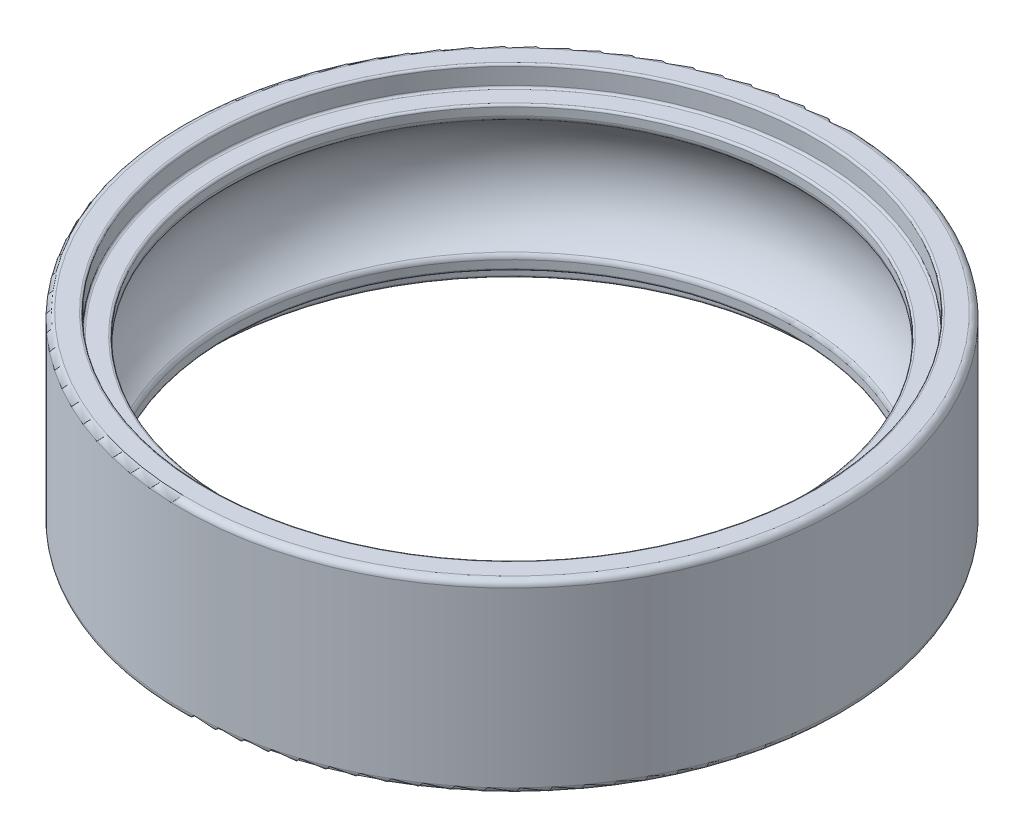
ISO-10303-21;
HEADER;
FILE_DESCRIPTION(('STEP AP214'),'2;1');
FILE_NAME('part.step','',(''),(''),'','','');
FILE_SCHEMA(('AUTOMOTIVE_DESIGN { 1 0 10303 214 1 1 1 1 }'));
ENDSEC;
DATA;
#1=APPLICATION_CONTEXT('core data for automotive mechanical design processes');
#2=APPLICATION_PROTOCOL_DEFINITION('international standard','automotive_design',2000,#1);
#3=PRODUCT_CONTEXT('',#1,'mechanical');
#4=PRODUCT('Part','Part','',(#3));
#5=PRODUCT_RELATED_PRODUCT_CATEGORY('part','',(#4));
#6=PRODUCT_DEFINITION_FORMATION('','',#4);
#7=PRODUCT_DEFINITION_CONTEXT('part definition',#1,'design');
#8=PRODUCT_DEFINITION('design','',#6,#7);
#9=PRODUCT_DEFINITION_SHAPE('','',#8);
#10=(LENGTH_UNIT() NAMED_UNIT(*) SI_UNIT(.MILLI.,.METRE.));
#11=(NAMED_UNIT(*) PLANE_ANGLE_UNIT() SI_UNIT($,.RADIAN.));
#12=(NAMED_UNIT(*) SI_UNIT($,.STERADIAN.) SOLID_ANGLE_UNIT());
#13=UNCERTAINTY_MEASURE_WITH_UNIT(LENGTH_MEASURE(1.E-05),#10,'distance_accuracy_value','');
#14=(GEOMETRIC_REPRESENTATION_CONTEXT(3) GLOBAL_UNCERTAINTY_ASSIGNED_CONTEXT((#13)) GLOBAL_UNIT_ASSIGNED_CONTEXT((#10,
#11,#12)) REPRESENTATION_CONTEXT('',''));
#15=CARTESIAN_POINT('',(0.,0.,0.));
#16=DIRECTION('',(0.,0.,1.));
#17=DIRECTION('',(1.,0.,0.));
#18=AXIS2_PLACEMENT_3D('',#15,#16,#17);
#19=CARTESIAN_POINT('',(0.,-4.1,0.));
#20=DIRECTION('',(0.,1.,0.));
#21=DIRECTION('',(-1.,0.,0.));
#22=AXIS2_PLACEMENT_3D('',#19,#20,#21);
#23=TOROIDAL_SURFACE('',#22,14.85,0.1);
#24=CARTESIAN_POINT('',(0.,-4.1,0.));
#25=DIRECTION('',(0.,-1.,0.));
#26=DIRECTION('',(1.,0.,0.));
#27=AXIS2_PLACEMENT_3D('',#24,#25,#26);
#28=CIRCLE('',#27,14.75);
#29=CARTESIAN_POINT('',(14.75,-4.1,0.));
#30=VERTEX_POINT('',#29);
#31=EDGE_CURVE('E145',#30,#30,#28,.T.);
#32=ORIENTED_EDGE('',*,*,#31,.T.);
#33=CARTESIAN_POINT('',(14.85,-4.1,0.));
#34=DIRECTION('',(0.,0.,-1.));
#35=DIRECTION('',(1.,0.,0.));
#36=AXIS2_PLACEMENT_3D('',#33,#34,#35);
#37=CIRCLE('',#36,0.1);
#38=CARTESIAN_POINT('',(14.85,-4.,0.));
#39=VERTEX_POINT('',#38);
#40=EDGE_CURVE('E11',#30,#39,#37,.T.);
#41=ORIENTED_EDGE('',*,*,#40,.T.);
#42=CARTESIAN_POINT('',(0.,-4.,0.));
#43=DIRECTION('',(0.,-1.,0.));
#44=DIRECTION('',(-1.,0.,0.));
#45=AXIS2_PLACEMENT_3D('',#42,#43,#44);
#46=CIRCLE('',#45,14.85);
#47=EDGE_CURVE('E25',#39,#39,#46,.T.);
#48=ORIENTED_EDGE('',*,*,#47,.F.);
#49=ORIENTED_EDGE('',*,*,#40,.F.);
#50=EDGE_LOOP('',(#32,#41,#48,#49));
#51=FACE_BOUND('',#50,.T.);
#52=ADVANCED_FACE('F17',(#51),#23,.T.);
#53=CARTESIAN_POINT('',(-4.307003376255,-4.,15.40940368466));
#54=DIRECTION('',(0.,1.,0.));
#55=DIRECTION('',(1.,0.,0.));
#56=AXIS2_PLACEMENT_3D('',#53,#54,#55);
#57=PLANE('',#56);
#58=ORIENTED_EDGE('',*,*,#47,.T.);
#59=EDGE_LOOP('',(#58));
#60=FACE_BOUND('',#59,.T.);
#61=CARTESIAN_POINT('',(0.,-4.,0.));
#62=DIRECTION('',(0.,1.,0.));
#63=DIRECTION('',(-0.963087730291494,0.,-0.269187711015898));
#64=AXIS2_PLACEMENT_3D('',#61,#62,#63);
#65=CIRCLE('',#64,15.7);
#66=CARTESIAN_POINT('',(-15.7,-4.,0.));
#67=VERTEX_POINT('',#66);
#68=EDGE_CURVE('E43',#67,#67,#65,.T.);
#69=ORIENTED_EDGE('',*,*,#68,.T.);
#70=EDGE_LOOP('',(#69));
#71=FACE_BOUND('',#70,.T.);
#72=ADVANCED_FACE('F288',(#60,#71),#57,.T.);
#73=CARTESIAN_POINT('',(0.,-4.3,0.));
#74=DIRECTION('',(0.,-1.,0.));
#75=DIRECTION('',(1.,0.,0.));
#76=AXIS2_PLACEMENT_3D('',#73,#74,#75);
#77=TOROIDAL_SURFACE('',#76,15.7,0.3);
#78=CARTESIAN_POINT('',(0.,-4.3,0.));
#79=DIRECTION('',(0.,1.,0.));
#80=DIRECTION('',(-1.,0.,0.));
#81=AXIS2_PLACEMENT_3D('',#78,#79,#80);
#82=CIRCLE('',#81,16.);
#83=CARTESIAN_POINT('',(-16.,-4.3,0.));
#84=VERTEX_POINT('',#83);
#85=CARTESIAN_POINT('',(16.,-4.3,0.));
#86=VERTEX_POINT('',#85);
#87=EDGE_CURVE('E267',#84,#86,#82,.T.);
#88=ORIENTED_EDGE('',*,*,#87,.T.);
#89=CARTESIAN_POINT('',(0.,-4.3,0.));
#90=DIRECTION('',(0.,1.,0.));
#91=DIRECTION('',(-1.,0.,0.));
#92=AXIS2_PLACEMENT_3D('',#89,#90,#91);
#93=CIRCLE('',#92,16.);
#94=EDGE_CURVE('E272',#86,#84,#93,.T.);
#95=ORIENTED_EDGE('',*,*,#94,.T.);
#96=CARTESIAN_POINT('',(-15.7,-4.3,0.));
#97=DIRECTION('',(0.,0.,-1.));
#98=DIRECTION('',(-1.,0.,0.));
#99=AXIS2_PLACEMENT_3D('',#96,#97,#98);
#100=CIRCLE('',#99,0.3);
#101=EDGE_CURVE('E280',#84,#67,#100,.T.);
#102=ORIENTED_EDGE('',*,*,#101,.T.);
#103=ORIENTED_EDGE('',*,*,#68,.F.);
#104=ORIENTED_EDGE('',*,*,#101,.F.);
#105=EDGE_LOOP('',(#88,#95,#102,#103,#104));
#106=FACE_BOUND('',#105,.T.);
#107=ADVANCED_FACE('F320',(#106),#77,.T.);
#108=CARTESIAN_POINT('',(0.,11.08001605136,0.));
#109=DIRECTION('',(0.,-1.,0.));
#110=DIRECTION('',(-1.,0.,0.));
#111=AXIS2_PLACEMENT_3D('',#108,#109,#110);
#112=CYLINDRICAL_SURFACE('',#111,16.);
#113=CARTESIAN_POINT('',(0.,-12.7,0.));
#114=DIRECTION('',(0.,-1.,0.));
#115=DIRECTION('',(-1.,0.,0.));
#116=AXIS2_PLACEMENT_3D('',#113,#114,#115);
#117=CIRCLE('',#116,16.);
#118=CARTESIAN_POINT('',(16.,-12.7,0.));
#119=VERTEX_POINT('',#118);
#120=EDGE_CURVE('E256',#119,#119,#117,.T.);
#121=ORIENTED_EDGE('',*,*,#120,.F.);
#122=DIRECTION('',(0.,1.,0.));
#123=VECTOR('',#122,1.);
#124=CARTESIAN_POINT('',(16.,11.08001605136,0.));
#125=LINE('',#124,#123);
#126=EDGE_CURVE('E264',#119,#86,#125,.T.);
#127=ORIENTED_EDGE('',*,*,#126,.T.);
#128=ORIENTED_EDGE('',*,*,#87,.F.);
#129=ORIENTED_EDGE('',*,*,#94,.F.);
#130=ORIENTED_EDGE('',*,*,#126,.F.);
#131=EDGE_LOOP('',(#121,#127,#128,#129,#130));
#132=FACE_BOUND('',#131,.T.);
#133=ADVANCED_FACE('F325',(#132),#112,.T.);
#134=CARTESIAN_POINT('',(0.,-12.7,0.));
#135=DIRECTION('',(0.,1.,0.));
#136=DIRECTION('',(-1.,0.,0.));
#137=AXIS2_PLACEMENT_3D('',#134,#135,#136);
#138=TOROIDAL_SURFACE('',#137,15.7,0.3);
#139=ORIENTED_EDGE('',*,*,#120,.T.);
#140=CARTESIAN_POINT('',(15.7,-12.7,0.));
#141=DIRECTION('',(0.,0.,-1.));
#142=DIRECTION('',(1.,0.,0.));
#143=AXIS2_PLACEMENT_3D('',#140,#141,#142);
#144=CIRCLE('',#143,0.3);
#145=CARTESIAN_POINT('',(15.7,-13.,0.));
#146=VERTEX_POINT('',#145);
#147=EDGE_CURVE('E265',#119,#146,#144,.T.);
#148=ORIENTED_EDGE('',*,*,#147,.T.);
#149=CARTESIAN_POINT('',(0.,-13.,0.));
#150=DIRECTION('',(0.,-1.,0.));
#151=DIRECTION('',(1.,0.,0.));
#152=AXIS2_PLACEMENT_3D('',#149,#150,#151);
#153=CIRCLE('',#152,15.7);
#154=EDGE_CURVE('E255',#146,#146,#153,.T.);
#155=ORIENTED_EDGE('',*,*,#154,.F.);
#156=ORIENTED_EDGE('',*,*,#147,.F.);
#157=EDGE_LOOP('',(#139,#148,#155,#156));
#158=FACE_BOUND('',#157,.T.);
#159=ADVANCED_FACE('F327',(#158),#138,.T.);
#160=CARTESIAN_POINT('',(-4.307003376255,-13.,15.40940368466));
#161=DIRECTION('',(0.,-1.,0.));
#162=DIRECTION('',(0.,0.,-1.));
#163=AXIS2_PLACEMENT_3D('',#160,#161,#162);
#164=PLANE('',#163);
#165=CARTESIAN_POINT('',(0.,-13.,0.));
#166=DIRECTION('',(0.,1.,0.));
#167=DIRECTION('',(1.,0.,0.));
#168=AXIS2_PLACEMENT_3D('',#165,#166,#167);
#169=CIRCLE('',#168,14.85);
#170=CARTESIAN_POINT('',(14.85,-13.,0.));
#171=VERTEX_POINT('',#170);
#172=EDGE_CURVE('E250',#171,#171,#169,.T.);
#173=ORIENTED_EDGE('',*,*,#172,.T.);
#174=EDGE_LOOP('',(#173));
#175=FACE_BOUND('',#174,.T.);
#176=ORIENTED_EDGE('',*,*,#154,.T.);
#177=EDGE_LOOP('',(#176));
#178=FACE_BOUND('',#177,.T.);
#179=ADVANCED_FACE('F331',(#175,#178),#164,.T.);
#180=CARTESIAN_POINT('',(0.,-12.9,0.));
#181=DIRECTION('',(0.,1.,0.));
#182=DIRECTION('',(-1.,0.,0.));
#183=AXIS2_PLACEMENT_3D('',#180,#181,#182);
#184=TOROIDAL_SURFACE('',#183,14.85,0.1);
#185=ORIENTED_EDGE('',*,*,#172,.F.);
#186=CARTESIAN_POINT('',(14.85,-12.9,0.));
#187=DIRECTION('',(0.,0.,-1.));
#188=DIRECTION('',(1.,0.,0.));
#189=AXIS2_PLACEMENT_3D('',#186,#187,#188);
#190=CIRCLE('',#189,0.1);
#191=CARTESIAN_POINT('',(14.75,-12.9,0.));
#192=VERTEX_POINT('',#191);
#193=EDGE_CURVE('E253',#171,#192,#190,.T.);
#194=ORIENTED_EDGE('',*,*,#193,.T.);
#195=CARTESIAN_POINT('',(0.,-12.9,0.));
#196=DIRECTION('',(0.,1.,0.));
#197=DIRECTION('',(-1.,0.,0.));
#198=AXIS2_PLACEMENT_3D('',#195,#196,#197);
#199=CIRCLE('',#198,14.75);
#200=EDGE_CURVE('E242',#192,#192,#199,.T.);
#201=ORIENTED_EDGE('',*,*,#200,.T.);
#202=ORIENTED_EDGE('',*,*,#193,.F.);
#203=EDGE_LOOP('',(#185,#194,#201,#202));
#204=FACE_BOUND('',#203,.T.);
#205=ADVANCED_FACE('F329',(#204),#184,.T.);
#206=CARTESIAN_POINT('',(0.,10.58001605136,0.));
#207=DIRECTION('',(0.,-1.,0.));
#208=DIRECTION('',(-1.,0.,0.));
#209=AXIS2_PLACEMENT_3D('',#206,#207,#208);
#210=CYLINDRICAL_SURFACE('',#209,14.75);
#211=CARTESIAN_POINT('',(0.,-12.1,0.));
#212=DIRECTION('',(0.,-1.,0.));
#213=DIRECTION('',(1.,0.,0.));
#214=AXIS2_PLACEMENT_3D('',#211,#212,#213);
#215=CIRCLE('',#214,14.75);
#216=CARTESIAN_POINT('',(14.75,-12.1,0.));
#217=VERTEX_POINT('',#216);
#218=EDGE_CURVE('E234',#217,#217,#215,.T.);
#219=ORIENTED_EDGE('',*,*,#218,.F.);
#220=DIRECTION('',(0.,-1.,0.));
#221=VECTOR('',#220,1.);
#222=CARTESIAN_POINT('',(14.75,10.58001605136,0.));
#223=LINE('',#222,#221);
#224=EDGE_CURVE('E237',#217,#192,#223,.T.);
#225=ORIENTED_EDGE('',*,*,#224,.T.);
#226=ORIENTED_EDGE('',*,*,#200,.F.);
#227=ORIENTED_EDGE('',*,*,#224,.F.);
#228=EDGE_LOOP('',(#219,#225,#226,#227));
#229=FACE_BOUND('',#228,.T.);
#230=ADVANCED_FACE('F334',(#229),#210,.F.);
#231=CARTESIAN_POINT('',(0.,-12.1,0.));
#232=DIRECTION('',(0.,1.,0.));
#233=DIRECTION('',(-1.,0.,0.));
#234=AXIS2_PLACEMENT_3D('',#231,#232,#233);
#235=TOROIDAL_SURFACE('',#234,14.65,0.1);
#236=ORIENTED_EDGE('',*,*,#218,.T.);
#237=CARTESIAN_POINT('',(14.65,-12.1,0.));
#238=DIRECTION('',(0.,0.,1.));
#239=DIRECTION('',(1.,0.,0.));
#240=AXIS2_PLACEMENT_3D('',#237,#238,#239);
#241=CIRCLE('',#240,0.1);
#242=CARTESIAN_POINT('',(14.65,-12.,0.));
#243=VERTEX_POINT('',#242);
#244=EDGE_CURVE('E240',#217,#243,#241,.T.);
#245=ORIENTED_EDGE('',*,*,#244,.T.);
#246=CARTESIAN_POINT('',(0.,-12.,0.));
#247=DIRECTION('',(0.,-1.,0.));
#248=DIRECTION('',(-1.,0.,0.));
#249=AXIS2_PLACEMENT_3D('',#246,#247,#248);
#250=CIRCLE('',#249,14.65);
#251=EDGE_CURVE('E181',#243,#243,#250,.T.);
#252=ORIENTED_EDGE('',*,*,#251,.F.);
#253=ORIENTED_EDGE('',*,*,#244,.F.);
#254=EDGE_LOOP('',(#236,#245,#252,#253));
#255=FACE_BOUND('',#254,.T.);
#256=ADVANCED_FACE('F338',(#255),#235,.F.);
#257=CARTESIAN_POINT('',(-3.943599966383,-12.,14.10923524877));
#258=DIRECTION('',(0.,-1.,0.));
#259=DIRECTION('',(0.,0.,-1.));
#260=AXIS2_PLACEMENT_3D('',#257,#258,#259);
#261=PLANE('',#260);
#262=CARTESIAN_POINT('',(0.,-12.,0.));
#263=DIRECTION('',(0.,1.,0.));
#264=DIRECTION('',(1.,0.,0.));
#265=AXIS2_PLACEMENT_3D('',#262,#263,#264);
#266=CIRCLE('',#265,13.85);
#267=CARTESIAN_POINT('',(13.85,-12.,0.));
#268=VERTEX_POINT('',#267);
#269=EDGE_CURVE('E183',#268,#268,#266,.T.);
#270=ORIENTED_EDGE('',*,*,#269,.T.);
#271=EDGE_LOOP('',(#270));
#272=FACE_BOUND('',#271,.T.);
#273=ORIENTED_EDGE('',*,*,#251,.T.);
#274=EDGE_LOOP('',(#273));
#275=FACE_BOUND('',#274,.T.);
#276=ADVANCED_FACE('F344',(#272,#275),#261,.T.);
#277=CARTESIAN_POINT('',(0.,-11.9,0.));
#278=DIRECTION('',(0.,1.,0.));
#279=DIRECTION('',(-1.,0.,0.));
#280=AXIS2_PLACEMENT_3D('',#277,#278,#279);
#281=TOROIDAL_SURFACE('',#280,13.85,0.1);
#282=ORIENTED_EDGE('',*,*,#269,.F.);
#283=CARTESIAN_POINT('',(13.85,-11.9,0.));
#284=DIRECTION('',(0.,0.,-1.));
#285=DIRECTION('',(1.,0.,0.));
#286=AXIS2_PLACEMENT_3D('',#283,#284,#285);
#287=CIRCLE('',#286,0.1);
#288=CARTESIAN_POINT('',(13.75,-11.9,0.));
#289=VERTEX_POINT('',#288);
#290=EDGE_CURVE('E180',#268,#289,#287,.T.);
#291=ORIENTED_EDGE('',*,*,#290,.T.);
#292=CARTESIAN_POINT('',(0.,-11.9,0.));
#293=DIRECTION('',(0.,1.,0.));
#294=DIRECTION('',(-1.,0.,0.));
#295=AXIS2_PLACEMENT_3D('',#292,#293,#294);
#296=CIRCLE('',#295,13.75);
#297=EDGE_CURVE('E225',#289,#289,#296,.T.);
#298=ORIENTED_EDGE('',*,*,#297,.T.);
#299=ORIENTED_EDGE('',*,*,#290,.F.);
#300=EDGE_LOOP('',(#282,#291,#298,#299));
#301=FACE_BOUND('',#300,.T.);
#302=ADVANCED_FACE('F349',(#301),#281,.T.);
#303=CARTESIAN_POINT('',(0.,10.58001605136,0.));
#304=DIRECTION('',(0.,-1.,0.));
#305=DIRECTION('',(-1.,0.,0.));
#306=AXIS2_PLACEMENT_3D('',#303,#304,#305);
#307=CYLINDRICAL_SURFACE('',#306,13.75);
#308=CARTESIAN_POINT('',(0.,-11.52489669245,0.));
#309=DIRECTION('',(0.,-1.,0.));
#310=DIRECTION('',(1.,0.,0.));
#311=AXIS2_PLACEMENT_3D('',#308,#309,#310);
#312=CIRCLE('',#311,13.75);
#313=CARTESIAN_POINT('',(13.75,-11.52489669245,0.));
#314=VERTEX_POINT('',#313);
#315=EDGE_CURVE('E213',#314,#314,#312,.T.);
#316=ORIENTED_EDGE('',*,*,#315,.F.);
#317=DIRECTION('',(0.,-1.,0.));
#318=VECTOR('',#317,1.);
#319=CARTESIAN_POINT('',(13.75,10.58001605136,0.));
#320=LINE('',#319,#318);
#321=EDGE_CURVE('E217',#314,#289,#320,.T.);
#322=ORIENTED_EDGE('',*,*,#321,.T.);
#323=ORIENTED_EDGE('',*,*,#297,.F.);
#324=ORIENTED_EDGE('',*,*,#321,.F.);
#325=EDGE_LOOP('',(#316,#322,#323,#324));
#326=FACE_BOUND('',#325,.T.);
#327=ADVANCED_FACE('F346',(#326),#307,.F.);
#328=CARTESIAN_POINT('',(0.,-11.52489669245,0.));
#329=DIRECTION('',(0.,1.,0.));
#330=DIRECTION('',(-1.,0.,0.));
#331=AXIS2_PLACEMENT_3D('',#328,#329,#330);
#332=TOROIDAL_SURFACE('',#331,14.05,0.3);
#333=ORIENTED_EDGE('',*,*,#315,.T.);
#334=CARTESIAN_POINT('',(14.05,-11.52489669245,0.));
#335=DIRECTION('',(0.,0.,-1.));
#336=DIRECTION('',(1.,0.,0.));
#337=AXIS2_PLACEMENT_3D('',#334,#335,#336);
#338=CIRCLE('',#337,0.3);
#339=CARTESIAN_POINT('',(13.86842105263,-11.28608905884,0.));
#340=VERTEX_POINT('',#339);
#341=EDGE_CURVE('E143',#314,#340,#338,.T.);
#342=ORIENTED_EDGE('',*,*,#341,.T.);
#343=CARTESIAN_POINT('',(0.,-11.28608905884,0.));
#344=DIRECTION('',(0.,1.,0.));
#345=DIRECTION('',(1.,0.,0.));
#346=AXIS2_PLACEMENT_3D('',#343,#344,#345);
#347=CIRCLE('',#346,13.86842105263);
#348=CARTESIAN_POINT('',(0.,-11.28608905884,-13.86842105263));
#349=VERTEX_POINT('',#348);
#350=EDGE_CURVE('E133',#340,#349,#347,.T.);
#351=ORIENTED_EDGE('',*,*,#350,.T.);
#352=CARTESIAN_POINT('',(0.,-11.28608905884,0.));
#353=DIRECTION('',(0.,1.,0.));
#354=DIRECTION('',(1.,0.,0.));
#355=AXIS2_PLACEMENT_3D('',#352,#353,#354);
#356=CIRCLE('',#355,13.86842105263);
#357=EDGE_CURVE('E138',#349,#340,#356,.T.);
#358=ORIENTED_EDGE('',*,*,#357,.T.);
#359=ORIENTED_EDGE('',*,*,#341,.F.);
#360=EDGE_LOOP('',(#333,#342,#351,#358,#359));
#361=FACE_BOUND('',#360,.T.);
#362=ADVANCED_FACE('F140',(#361),#332,.T.);
#363=CARTESIAN_POINT('',(0.,-5.475103307549,0.));
#364=DIRECTION('',(0.,-1.,0.));
#365=DIRECTION('',(1.,0.,0.));
#366=AXIS2_PLACEMENT_3D('',#363,#364,#365);
#367=TOROIDAL_SURFACE('',#366,14.05,0.3);
#368=CARTESIAN_POINT('',(0.,-5.475103307549,0.));
#369=DIRECTION('',(0.,1.,0.));
#370=DIRECTION('',(-1.,0.,0.));
#371=AXIS2_PLACEMENT_3D('',#368,#369,#370);
#372=CIRCLE('',#371,13.75);
#373=CARTESIAN_POINT('',(-13.75,-5.475103307549,0.));
#374=VERTEX_POINT('',#373);
#375=CARTESIAN_POINT('',(13.75,-5.475103307549,0.));
#376=VERTEX_POINT('',#375);
#377=EDGE_CURVE('E169',#374,#376,#372,.T.);
#378=ORIENTED_EDGE('',*,*,#377,.T.);
#379=CARTESIAN_POINT('',(0.,-5.475103307549,0.));
#380=DIRECTION('',(0.,1.,0.));
#381=DIRECTION('',(-1.,0.,0.));
#382=AXIS2_PLACEMENT_3D('',#379,#380,#381);
#383=CIRCLE('',#382,13.75);
#384=EDGE_CURVE('E162',#376,#374,#383,.T.);
#385=ORIENTED_EDGE('',*,*,#384,.T.);
#386=CARTESIAN_POINT('',(-14.05,-5.475103307549,0.));
#387=DIRECTION('',(0.,0.,-1.));
#388=DIRECTION('',(-1.,0.,0.));
#389=AXIS2_PLACEMENT_3D('',#386,#387,#388);
#390=CIRCLE('',#389,0.3);
#391=CARTESIAN_POINT('',(-13.86842105263,-5.713910941164,0.));
#392=VERTEX_POINT('',#391);
#393=EDGE_CURVE('E170',#374,#392,#390,.T.);
#394=ORIENTED_EDGE('',*,*,#393,.T.);
#395=CARTESIAN_POINT('',(0.,-5.713910941164,0.));
#396=DIRECTION('',(0.,-1.,0.));
#397=DIRECTION('',(-1.,0.,0.));
#398=AXIS2_PLACEMENT_3D('',#395,#396,#397);
#399=CIRCLE('',#398,13.86842105263);
#400=CARTESIAN_POINT('',(0.,-5.713910941164,-13.86842105263));
#401=VERTEX_POINT('',#400);
#402=EDGE_CURVE('E152',#392,#401,#399,.T.);
#403=ORIENTED_EDGE('',*,*,#402,.T.);
#404=CARTESIAN_POINT('',(0.,-5.713910941164,0.));
#405=DIRECTION('',(0.,-1.,0.));
#406=DIRECTION('',(-1.,0.,0.));
#407=AXIS2_PLACEMENT_3D('',#404,#405,#406);
#408=CIRCLE('',#407,13.86842105263);
#409=EDGE_CURVE('E144',#401,#392,#408,.T.);
#410=ORIENTED_EDGE('',*,*,#409,.T.);
#411=ORIENTED_EDGE('',*,*,#393,.F.);
#412=EDGE_LOOP('',(#378,#385,#394,#403,#410,#411));
#413=FACE_BOUND('',#412,.T.);
#414=ADVANCED_FACE('F360',(#413),#367,.T.);
#415=CARTESIAN_POINT('',(0.,11.58001605136,0.));
#416=DIRECTION('',(0.,-1.,0.));
#417=DIRECTION('',(-1.,0.,0.));
#418=AXIS2_PLACEMENT_3D('',#415,#416,#417);
#419=CYLINDRICAL_SURFACE('',#418,13.75);
#420=CARTESIAN_POINT('',(0.,-5.1,0.));
#421=DIRECTION('',(0.,-1.,0.));
#422=DIRECTION('',(1.,0.,0.));
#423=AXIS2_PLACEMENT_3D('',#420,#421,#422);
#424=CIRCLE('',#423,13.75);
#425=CARTESIAN_POINT('',(13.75,-5.1,0.));
#426=VERTEX_POINT('',#425);
#427=EDGE_CURVE('E202',#426,#426,#424,.T.);
#428=ORIENTED_EDGE('',*,*,#427,.F.);
#429=DIRECTION('',(0.,-1.,0.));
#430=VECTOR('',#429,1.);
#431=CARTESIAN_POINT('',(13.75,11.58001605136,0.));
#432=LINE('',#431,#430);
#433=EDGE_CURVE('E166',#426,#376,#432,.T.);
#434=ORIENTED_EDGE('',*,*,#433,.T.);
#435=ORIENTED_EDGE('',*,*,#377,.F.);
#436=ORIENTED_EDGE('',*,*,#384,.F.);
#437=ORIENTED_EDGE('',*,*,#433,.F.);
#438=EDGE_LOOP('',(#428,#434,#435,#436,#437));
#439=FACE_BOUND('',#438,.T.);
#440=ADVANCED_FACE('F306',(#439),#419,.F.);
#441=CARTESIAN_POINT('',(0.,-5.1,0.));
#442=DIRECTION('',(0.,1.,0.));
#443=DIRECTION('',(-1.,0.,0.));
#444=AXIS2_PLACEMENT_3D('',#441,#442,#443);
#445=TOROIDAL_SURFACE('',#444,13.85,0.1);
#446=ORIENTED_EDGE('',*,*,#427,.T.);
#447=CARTESIAN_POINT('',(13.85,-5.1,0.));
#448=DIRECTION('',(0.,0.,-1.));
#449=DIRECTION('',(1.,0.,0.));
#450=AXIS2_PLACEMENT_3D('',#447,#448,#449);
#451=CIRCLE('',#450,0.1);
#452=CARTESIAN_POINT('',(13.85,-5.,0.));
#453=VERTEX_POINT('',#452);
#454=EDGE_CURVE('E172',#426,#453,#451,.T.);
#455=ORIENTED_EDGE('',*,*,#454,.T.);
#456=CARTESIAN_POINT('',(0.,-5.,0.));
#457=DIRECTION('',(0.,-1.,0.));
#458=DIRECTION('',(-1.,0.,0.));
#459=AXIS2_PLACEMENT_3D('',#456,#457,#458);
#460=CIRCLE('',#459,13.85);
#461=EDGE_CURVE('E196',#453,#453,#460,.T.);
#462=ORIENTED_EDGE('',*,*,#461,.F.);
#463=ORIENTED_EDGE('',*,*,#454,.F.);
#464=EDGE_LOOP('',(#446,#455,#462,#463));
#465=FACE_BOUND('',#464,.T.);
#466=ADVANCED_FACE('F297',(#465),#445,.T.);
#467=CARTESIAN_POINT('',(-3.943599966383,-5.,14.10923524877));
#468=DIRECTION('',(0.,1.,0.));
#469=DIRECTION('',(1.,0.,0.));
#470=AXIS2_PLACEMENT_3D('',#467,#468,#469);
#471=PLANE('',#470);
#472=ORIENTED_EDGE('',*,*,#461,.T.);
#473=EDGE_LOOP('',(#472));
#474=FACE_BOUND('',#473,.T.);
#475=CARTESIAN_POINT('',(0.,-5.,0.));
#476=DIRECTION('',(0.,1.,0.));
#477=DIRECTION('',(0.963087730291494,0.,0.269187711015898));
#478=AXIS2_PLACEMENT_3D('',#475,#476,#477);
#479=CIRCLE('',#478,14.65);
#480=CARTESIAN_POINT('',(14.65,-5.,0.));
#481=VERTEX_POINT('',#480);
#482=EDGE_CURVE('E187',#481,#481,#479,.T.);
#483=ORIENTED_EDGE('',*,*,#482,.T.);
#484=EDGE_LOOP('',(#483));
#485=FACE_BOUND('',#484,.T.);
#486=ADVANCED_FACE('F296',(#474,#485),#471,.T.);
#487=CARTESIAN_POINT('',(0.,-4.9,0.));
#488=DIRECTION('',(0.,1.,0.));
#489=DIRECTION('',(-1.,0.,0.));
#490=AXIS2_PLACEMENT_3D('',#487,#488,#489);
#491=TOROIDAL_SURFACE('',#490,14.65,0.1);
#492=ORIENTED_EDGE('',*,*,#482,.F.);
#493=CARTESIAN_POINT('',(14.65,-4.9,0.));
#494=DIRECTION('',(0.,0.,1.));
#495=DIRECTION('',(1.,0.,0.));
#496=AXIS2_PLACEMENT_3D('',#493,#494,#495);
#497=CIRCLE('',#496,0.1);
#498=CARTESIAN_POINT('',(14.75,-4.9,0.));
#499=VERTEX_POINT('',#498);
#500=EDGE_CURVE('E193',#481,#499,#497,.T.);
#501=ORIENTED_EDGE('',*,*,#500,.T.);
#502=CARTESIAN_POINT('',(0.,-4.9,0.));
#503=DIRECTION('',(0.,1.,0.));
#504=DIRECTION('',(-1.,0.,0.));
#505=AXIS2_PLACEMENT_3D('',#502,#503,#504);
#506=CIRCLE('',#505,14.75);
#507=EDGE_CURVE('E182',#499,#499,#506,.T.);
#508=ORIENTED_EDGE('',*,*,#507,.T.);
#509=ORIENTED_EDGE('',*,*,#500,.F.);
#510=EDGE_LOOP('',(#492,#501,#508,#509));
#511=FACE_BOUND('',#510,.T.);
#512=ADVANCED_FACE('F292',(#511),#491,.F.);
#513=CARTESIAN_POINT('',(0.,11.58001605136,0.));
#514=DIRECTION('',(0.,-1.,0.));
#515=DIRECTION('',(-1.,0.,0.));
#516=AXIS2_PLACEMENT_3D('',#513,#514,#515);
#517=CYLINDRICAL_SURFACE('',#516,14.75);
#518=ORIENTED_EDGE('',*,*,#31,.F.);
#519=DIRECTION('',(0.,-1.,0.));
#520=VECTOR('',#519,1.);
#521=CARTESIAN_POINT('',(14.75,11.58001605136,0.));
#522=LINE('',#521,#520);
#523=EDGE_CURVE('E178',#30,#499,#522,.T.);
#524=ORIENTED_EDGE('',*,*,#523,.T.);
#525=ORIENTED_EDGE('',*,*,#507,.F.);
#526=ORIENTED_EDGE('',*,*,#523,.F.);
#527=EDGE_LOOP('',(#518,#524,#525,#526));
#528=FACE_BOUND('',#527,.T.);
#529=ADVANCED_FACE('F295',(#528),#517,.F.);
#530=CARTESIAN_POINT('',(0.,-8.5,0.));
#531=DIRECTION('',(0.,1.,0.));
#532=DIRECTION('',(0.,0.,1.));
#533=AXIS2_PLACEMENT_3D('',#530,#531,#532);
#534=TOROIDAL_SURFACE('',#533,11.75,3.5);
#535=ORIENTED_EDGE('',*,*,#357,.F.);
#536=CARTESIAN_POINT('',(0.,-8.5,-11.75));
#537=DIRECTION('',(1.,0.,0.));
#538=DIRECTION('',(0.,0.,-1.));
#539=AXIS2_PLACEMENT_3D('',#536,#537,#538);
#540=CIRCLE('',#539,3.5);
#541=EDGE_CURVE('E146',#349,#401,#540,.T.);
#542=ORIENTED_EDGE('',*,*,#541,.T.);
#543=ORIENTED_EDGE('',*,*,#402,.F.);
#544=ORIENTED_EDGE('',*,*,#409,.F.);
#545=ORIENTED_EDGE('',*,*,#541,.F.);
#546=ORIENTED_EDGE('',*,*,#350,.F.);
#547=EDGE_LOOP('',(#535,#542,#543,#544,#545,#546));
#548=FACE_BOUND('',#547,.T.);
#549=ADVANCED_FACE('F149',(#548),#534,.F.);
#550=CLOSED_SHELL('',(#52,#72,#107,#133,#159,#179,#205,#230,#256,#276,#302,#327,#362,#414,#440,
#466,#486,#512,#529,#549));
#551=MANIFOLD_SOLID_BREP('B1',#550);
#552=ADVANCED_BREP_SHAPE_REPRESENTATION('',(#18,#551),#14);
#553=SHAPE_DEFINITION_REPRESENTATION(#9,#552);
ENDSEC;
END-ISO-10303-21;
